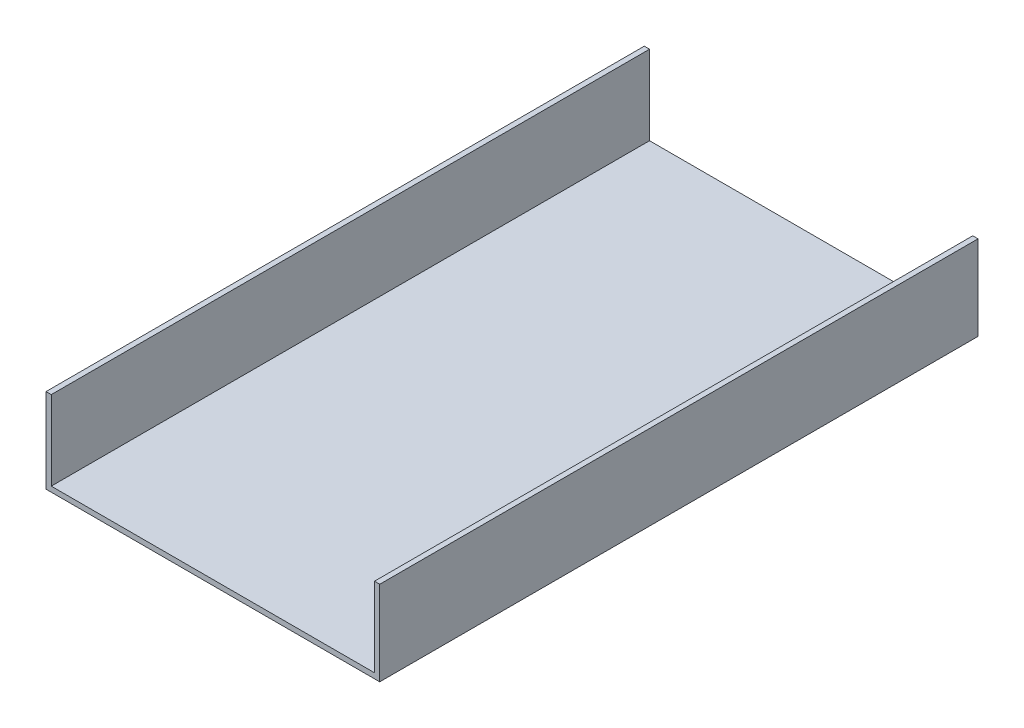
ISO-10303-21;
HEADER;
FILE_DESCRIPTION(('STEP AP214'),'2;1');
FILE_NAME('part.step','',(''),(''),'','','');
FILE_SCHEMA(('AUTOMOTIVE_DESIGN { 1 0 10303 214 1 1 1 1 }'));
ENDSEC;
DATA;
#1=APPLICATION_CONTEXT('core data for automotive mechanical design processes');
#2=APPLICATION_PROTOCOL_DEFINITION('international standard','automotive_design',2000,#1);
#3=PRODUCT_CONTEXT('',#1,'mechanical');
#4=PRODUCT('Part','Part','',(#3));
#5=PRODUCT_RELATED_PRODUCT_CATEGORY('part','',(#4));
#6=PRODUCT_DEFINITION_FORMATION('','',#4);
#7=PRODUCT_DEFINITION_CONTEXT('part definition',#1,'design');
#8=PRODUCT_DEFINITION('design','',#6,#7);
#9=PRODUCT_DEFINITION_SHAPE('','',#8);
#10=(LENGTH_UNIT() NAMED_UNIT(*) SI_UNIT(.MILLI.,.METRE.));
#11=(NAMED_UNIT(*) PLANE_ANGLE_UNIT() SI_UNIT($,.RADIAN.));
#12=(NAMED_UNIT(*) SI_UNIT($,.STERADIAN.) SOLID_ANGLE_UNIT());
#13=UNCERTAINTY_MEASURE_WITH_UNIT(LENGTH_MEASURE(1.E-05),#10,'distance_accuracy_value','');
#14=(GEOMETRIC_REPRESENTATION_CONTEXT(3) GLOBAL_UNCERTAINTY_ASSIGNED_CONTEXT((#13)) GLOBAL_UNIT_ASSIGNED_CONTEXT((#10,
#11,#12)) REPRESENTATION_CONTEXT('',''));
#15=CARTESIAN_POINT('',(0.,0.,0.));
#16=DIRECTION('',(0.,0.,1.));
#17=DIRECTION('',(1.,0.,0.));
#18=AXIS2_PLACEMENT_3D('',#15,#16,#17);
#19=CARTESIAN_POINT('',(-77.9170743405276,12.6132853717026,91.02));
#20=DIRECTION('',(0.,-1.,0.));
#21=DIRECTION('',(0.,0.,-1.));
#22=AXIS2_PLACEMENT_3D('',#19,#20,#21);
#23=PLANE('',#22);
#24=DIRECTION('',(-1.,0.,0.));
#25=VECTOR('',#24,1.);
#26=CARTESIAN_POINT('',(-77.9170743405276,12.6132853717026,91.02));
#27=LINE('',#26,#25);
#28=CARTESIAN_POINT('',(-76.3170743405276,12.6132853717026,91.02));
#29=VERTEX_POINT('',#28);
#30=CARTESIAN_POINT('',(-77.9170743405276,12.6132853717026,91.02));
#31=VERTEX_POINT('',#30);
#32=EDGE_CURVE('E52',#29,#31,#27,.T.);
#33=ORIENTED_EDGE('',*,*,#32,.F.);
#34=DIRECTION('',(0.,0.,1.));
#35=VECTOR('',#34,1.);
#36=CARTESIAN_POINT('',(-76.3170743405276,12.6132853717026,-91.02));
#37=LINE('',#36,#35);
#38=CARTESIAN_POINT('',(-76.3170743405276,12.6132853717026,-91.02));
#39=VERTEX_POINT('',#38);
#40=EDGE_CURVE('E119',#39,#29,#37,.T.);
#41=ORIENTED_EDGE('',*,*,#40,.F.);
#42=DIRECTION('',(-1.,0.,0.));
#43=VECTOR('',#42,1.);
#44=CARTESIAN_POINT('',(-77.9170743405276,12.6132853717026,-91.02));
#45=LINE('',#44,#43);
#46=CARTESIAN_POINT('',(-77.9170743405276,12.6132853717026,-91.02));
#47=VERTEX_POINT('',#46);
#48=EDGE_CURVE('E78',#39,#47,#45,.T.);
#49=ORIENTED_EDGE('',*,*,#48,.T.);
#50=DIRECTION('',(0.,0.,-1.));
#51=VECTOR('',#50,1.);
#52=CARTESIAN_POINT('',(-77.9170743405276,12.6132853717026,91.02));
#53=LINE('',#52,#51);
#54=EDGE_CURVE('E124',#31,#47,#53,.T.);
#55=ORIENTED_EDGE('',*,*,#54,.F.);
#56=EDGE_LOOP('',(#33,#41,#49,#55));
#57=FACE_BOUND('',#56,.T.);
#58=ADVANCED_FACE('F35',(#57),#23,.F.);
#59=CARTESIAN_POINT('',(0.,0.,91.02));
#60=DIRECTION('',(0.,0.,1.));
#61=DIRECTION('',(1.,0.,0.));
#62=AXIS2_PLACEMENT_3D('',#59,#60,#61);
#63=PLANE('',#62);
#64=DIRECTION('',(0.,-1.,0.));
#65=VECTOR('',#64,1.);
#66=CARTESIAN_POINT('',(-76.3170743405276,11.0132853717026,91.02));
#67=LINE('',#66,#65);
#68=CARTESIAN_POINT('',(-76.3170743405276,-11.5067146282974,91.02));
#69=VERTEX_POINT('',#68);
#70=EDGE_CURVE('E109',#29,#69,#67,.T.);
#71=ORIENTED_EDGE('',*,*,#70,.F.);
#72=ORIENTED_EDGE('',*,*,#32,.T.);
#73=DIRECTION('',(0.,-1.,0.));
#74=VECTOR('',#73,1.);
#75=CARTESIAN_POINT('',(-77.9170743405276,12.6132853717026,91.02));
#76=LINE('',#75,#74);
#77=CARTESIAN_POINT('',(-77.9170743405276,-13.1067146282974,91.02));
#78=VERTEX_POINT('',#77);
#79=EDGE_CURVE('E143',#31,#78,#76,.T.);
#80=ORIENTED_EDGE('',*,*,#79,.T.);
#81=DIRECTION('',(1.,0.,0.));
#82=VECTOR('',#81,1.);
#83=CARTESIAN_POINT('',(-77.9170743405276,-13.1067146282974,91.02));
#84=LINE('',#83,#82);
#85=CARTESIAN_POINT('',(23.6229256594724,-13.1067146282974,91.02));
#86=VERTEX_POINT('',#85);
#87=EDGE_CURVE('E85',#78,#86,#84,.T.);
#88=ORIENTED_EDGE('',*,*,#87,.T.);
#89=DIRECTION('',(0.,1.,0.));
#90=VECTOR('',#89,1.);
#91=CARTESIAN_POINT('',(23.6229256594724,12.6132853717026,91.02));
#92=LINE('',#91,#90);
#93=CARTESIAN_POINT('',(23.6229256594724,12.6132853717026,91.02));
#94=VERTEX_POINT('',#93);
#95=EDGE_CURVE('E127',#86,#94,#92,.T.);
#96=ORIENTED_EDGE('',*,*,#95,.T.);
#97=CARTESIAN_POINT('',(22.0229256594724,12.6132853717026,91.02));
#98=VERTEX_POINT('',#97);
#99=EDGE_CURVE('E126',#94,#98,#27,.T.);
#100=ORIENTED_EDGE('',*,*,#99,.T.);
#101=DIRECTION('',(0.,1.,0.));
#102=VECTOR('',#101,1.);
#103=CARTESIAN_POINT('',(22.0229256594724,11.0132853717026,91.02));
#104=LINE('',#103,#102);
#105=CARTESIAN_POINT('',(22.0229256594724,-11.5067146282974,91.02));
#106=VERTEX_POINT('',#105);
#107=EDGE_CURVE('E159',#106,#98,#104,.T.);
#108=ORIENTED_EDGE('',*,*,#107,.F.);
#109=DIRECTION('',(1.,0.,0.));
#110=VECTOR('',#109,1.);
#111=CARTESIAN_POINT('',(-76.3170743405276,-11.5067146282974,91.02));
#112=LINE('',#111,#110);
#113=EDGE_CURVE('E113',#69,#106,#112,.T.);
#114=ORIENTED_EDGE('',*,*,#113,.F.);
#115=EDGE_LOOP('',(#71,#72,#80,#88,#96,#100,#108,#114));
#116=FACE_BOUND('',#115,.T.);
#117=ADVANCED_FACE('F111',(#116),#63,.T.);
#118=CARTESIAN_POINT('',(0.,0.,-91.02));
#119=DIRECTION('',(0.,0.,1.));
#120=DIRECTION('',(1.,0.,0.));
#121=AXIS2_PLACEMENT_3D('',#118,#119,#120);
#122=PLANE('',#121);
#123=ORIENTED_EDGE('',*,*,#48,.F.);
#124=DIRECTION('',(0.,-1.,0.));
#125=VECTOR('',#124,1.);
#126=CARTESIAN_POINT('',(-76.3170743405276,11.0132853717026,-91.02));
#127=LINE('',#126,#125);
#128=CARTESIAN_POINT('',(-76.3170743405276,-11.5067146282974,-91.02));
#129=VERTEX_POINT('',#128);
#130=EDGE_CURVE('E121',#39,#129,#127,.T.);
#131=ORIENTED_EDGE('',*,*,#130,.T.);
#132=DIRECTION('',(1.,0.,0.));
#133=VECTOR('',#132,1.);
#134=CARTESIAN_POINT('',(-76.3170743405276,-11.5067146282974,-91.02));
#135=LINE('',#134,#133);
#136=CARTESIAN_POINT('',(22.0229256594724,-11.5067146282974,-91.02));
#137=VERTEX_POINT('',#136);
#138=EDGE_CURVE('E167',#129,#137,#135,.T.);
#139=ORIENTED_EDGE('',*,*,#138,.T.);
#140=DIRECTION('',(0.,1.,0.));
#141=VECTOR('',#140,1.);
#142=CARTESIAN_POINT('',(22.0229256594724,11.0132853717026,-91.02));
#143=LINE('',#142,#141);
#144=CARTESIAN_POINT('',(22.0229256594724,12.6132853717026,-91.02));
#145=VERTEX_POINT('',#144);
#146=EDGE_CURVE('E117',#137,#145,#143,.T.);
#147=ORIENTED_EDGE('',*,*,#146,.T.);
#148=CARTESIAN_POINT('',(23.6229256594724,12.6132853717026,-91.02));
#149=VERTEX_POINT('',#148);
#150=EDGE_CURVE('E140',#149,#145,#45,.T.);
#151=ORIENTED_EDGE('',*,*,#150,.F.);
#152=DIRECTION('',(0.,1.,0.));
#153=VECTOR('',#152,1.);
#154=CARTESIAN_POINT('',(23.6229256594724,12.6132853717026,-91.02));
#155=LINE('',#154,#153);
#156=CARTESIAN_POINT('',(23.6229256594724,-13.1067146282974,-91.02));
#157=VERTEX_POINT('',#156);
#158=EDGE_CURVE('E71',#157,#149,#155,.T.);
#159=ORIENTED_EDGE('',*,*,#158,.F.);
#160=DIRECTION('',(1.,0.,0.));
#161=VECTOR('',#160,1.);
#162=CARTESIAN_POINT('',(-77.9170743405276,-13.1067146282974,-91.02));
#163=LINE('',#162,#161);
#164=CARTESIAN_POINT('',(-77.9170743405276,-13.1067146282974,-91.02));
#165=VERTEX_POINT('',#164);
#166=EDGE_CURVE('E136',#165,#157,#163,.T.);
#167=ORIENTED_EDGE('',*,*,#166,.F.);
#168=DIRECTION('',(0.,-1.,0.));
#169=VECTOR('',#168,1.);
#170=CARTESIAN_POINT('',(-77.9170743405276,12.6132853717026,-91.02));
#171=LINE('',#170,#169);
#172=EDGE_CURVE('E133',#47,#165,#171,.T.);
#173=ORIENTED_EDGE('',*,*,#172,.F.);
#174=EDGE_LOOP('',(#123,#131,#139,#147,#151,#159,#167,#173));
#175=FACE_BOUND('',#174,.T.);
#176=ADVANCED_FACE('F150',(#175),#122,.F.);
#177=CARTESIAN_POINT('',(-77.9170743405276,12.6132853717026,91.02));
#178=DIRECTION('',(1.,0.,0.));
#179=DIRECTION('',(0.,0.,-1.));
#180=AXIS2_PLACEMENT_3D('',#177,#178,#179);
#181=PLANE('',#180);
#182=ORIENTED_EDGE('',*,*,#172,.T.);
#183=DIRECTION('',(0.,0.,-1.));
#184=VECTOR('',#183,1.);
#185=CARTESIAN_POINT('',(-77.9170743405276,-13.1067146282974,91.02));
#186=LINE('',#185,#184);
#187=EDGE_CURVE('E11',#78,#165,#186,.T.);
#188=ORIENTED_EDGE('',*,*,#187,.F.);
#189=ORIENTED_EDGE('',*,*,#79,.F.);
#190=ORIENTED_EDGE('',*,*,#54,.T.);
#191=EDGE_LOOP('',(#182,#188,#189,#190));
#192=FACE_BOUND('',#191,.T.);
#193=ADVANCED_FACE('F37',(#192),#181,.F.);
#194=CARTESIAN_POINT('',(-77.9170743405276,-13.1067146282974,91.02));
#195=DIRECTION('',(0.,1.,0.));
#196=DIRECTION('',(0.,0.,1.));
#197=AXIS2_PLACEMENT_3D('',#194,#195,#196);
#198=PLANE('',#197);
#199=ORIENTED_EDGE('',*,*,#166,.T.);
#200=DIRECTION('',(0.,0.,-1.));
#201=VECTOR('',#200,1.);
#202=CARTESIAN_POINT('',(23.6229256594724,-13.1067146282974,91.02));
#203=LINE('',#202,#201);
#204=EDGE_CURVE('E44',#86,#157,#203,.T.);
#205=ORIENTED_EDGE('',*,*,#204,.F.);
#206=ORIENTED_EDGE('',*,*,#87,.F.);
#207=ORIENTED_EDGE('',*,*,#187,.T.);
#208=EDGE_LOOP('',(#199,#205,#206,#207));
#209=FACE_BOUND('',#208,.T.);
#210=ADVANCED_FACE('F179',(#209),#198,.F.);
#211=CARTESIAN_POINT('',(23.6229256594724,12.6132853717026,91.02));
#212=DIRECTION('',(-1.,0.,0.));
#213=DIRECTION('',(0.,0.,1.));
#214=AXIS2_PLACEMENT_3D('',#211,#212,#213);
#215=PLANE('',#214);
#216=ORIENTED_EDGE('',*,*,#158,.T.);
#217=DIRECTION('',(0.,0.,-1.));
#218=VECTOR('',#217,1.);
#219=CARTESIAN_POINT('',(23.6229256594724,12.6132853717026,91.02));
#220=LINE('',#219,#218);
#221=EDGE_CURVE('E145',#94,#149,#220,.T.);
#222=ORIENTED_EDGE('',*,*,#221,.F.);
#223=ORIENTED_EDGE('',*,*,#95,.F.);
#224=ORIENTED_EDGE('',*,*,#204,.T.);
#225=EDGE_LOOP('',(#216,#222,#223,#224));
#226=FACE_BOUND('',#225,.T.);
#227=ADVANCED_FACE('F147',(#226),#215,.F.);
#228=ORIENTED_EDGE('',*,*,#150,.T.);
#229=DIRECTION('',(0.,0.,-1.));
#230=VECTOR('',#229,1.);
#231=CARTESIAN_POINT('',(22.0229256594724,12.6132853717026,-91.02));
#232=LINE('',#231,#230);
#233=EDGE_CURVE('E122',#98,#145,#232,.T.);
#234=ORIENTED_EDGE('',*,*,#233,.F.);
#235=ORIENTED_EDGE('',*,*,#99,.F.);
#236=ORIENTED_EDGE('',*,*,#221,.T.);
#237=EDGE_LOOP('',(#228,#234,#235,#236));
#238=FACE_BOUND('',#237,.T.);
#239=ADVANCED_FACE('F157',(#238),#23,.F.);
#240=CARTESIAN_POINT('',(-76.3170743405276,11.0132853717026,91.02));
#241=DIRECTION('',(1.,0.,0.));
#242=DIRECTION('',(0.,0.,-1.));
#243=AXIS2_PLACEMENT_3D('',#240,#241,#242);
#244=PLANE('',#243);
#245=ORIENTED_EDGE('',*,*,#70,.T.);
#246=DIRECTION('',(0.,0.,-1.));
#247=VECTOR('',#246,1.);
#248=CARTESIAN_POINT('',(-76.3170743405276,-11.5067146282974,91.02));
#249=LINE('',#248,#247);
#250=EDGE_CURVE('E137',#69,#129,#249,.T.);
#251=ORIENTED_EDGE('',*,*,#250,.T.);
#252=ORIENTED_EDGE('',*,*,#130,.F.);
#253=ORIENTED_EDGE('',*,*,#40,.T.);
#254=EDGE_LOOP('',(#245,#251,#252,#253));
#255=FACE_BOUND('',#254,.T.);
#256=ADVANCED_FACE('F120',(#255),#244,.T.);
#257=CARTESIAN_POINT('',(-76.3170743405276,-11.5067146282974,91.02));
#258=DIRECTION('',(0.,1.,0.));
#259=DIRECTION('',(0.,0.,1.));
#260=AXIS2_PLACEMENT_3D('',#257,#258,#259);
#261=PLANE('',#260);
#262=ORIENTED_EDGE('',*,*,#138,.F.);
#263=ORIENTED_EDGE('',*,*,#250,.F.);
#264=ORIENTED_EDGE('',*,*,#113,.T.);
#265=DIRECTION('',(0.,0.,-1.));
#266=VECTOR('',#265,1.);
#267=CARTESIAN_POINT('',(22.0229256594724,-11.5067146282974,91.02));
#268=LINE('',#267,#266);
#269=EDGE_CURVE('E164',#106,#137,#268,.T.);
#270=ORIENTED_EDGE('',*,*,#269,.T.);
#271=EDGE_LOOP('',(#262,#263,#264,#270));
#272=FACE_BOUND('',#271,.T.);
#273=ADVANCED_FACE('F177',(#272),#261,.T.);
#274=CARTESIAN_POINT('',(22.0229256594724,11.0132853717026,91.02));
#275=DIRECTION('',(-1.,0.,0.));
#276=DIRECTION('',(0.,0.,1.));
#277=AXIS2_PLACEMENT_3D('',#274,#275,#276);
#278=PLANE('',#277);
#279=ORIENTED_EDGE('',*,*,#233,.T.);
#280=ORIENTED_EDGE('',*,*,#146,.F.);
#281=ORIENTED_EDGE('',*,*,#269,.F.);
#282=ORIENTED_EDGE('',*,*,#107,.T.);
#283=EDGE_LOOP('',(#279,#280,#281,#282));
#284=FACE_BOUND('',#283,.T.);
#285=ADVANCED_FACE('F173',(#284),#278,.T.);
#286=CLOSED_SHELL('',(#58,#117,#176,#193,#210,#227,#239,#256,#273,#285));
#287=MANIFOLD_SOLID_BREP('B2',#286);
#288=ADVANCED_BREP_SHAPE_REPRESENTATION('',(#18,#287),#14);
#289=SHAPE_DEFINITION_REPRESENTATION(#9,#288);
ENDSEC;
END-ISO-10303-21;
